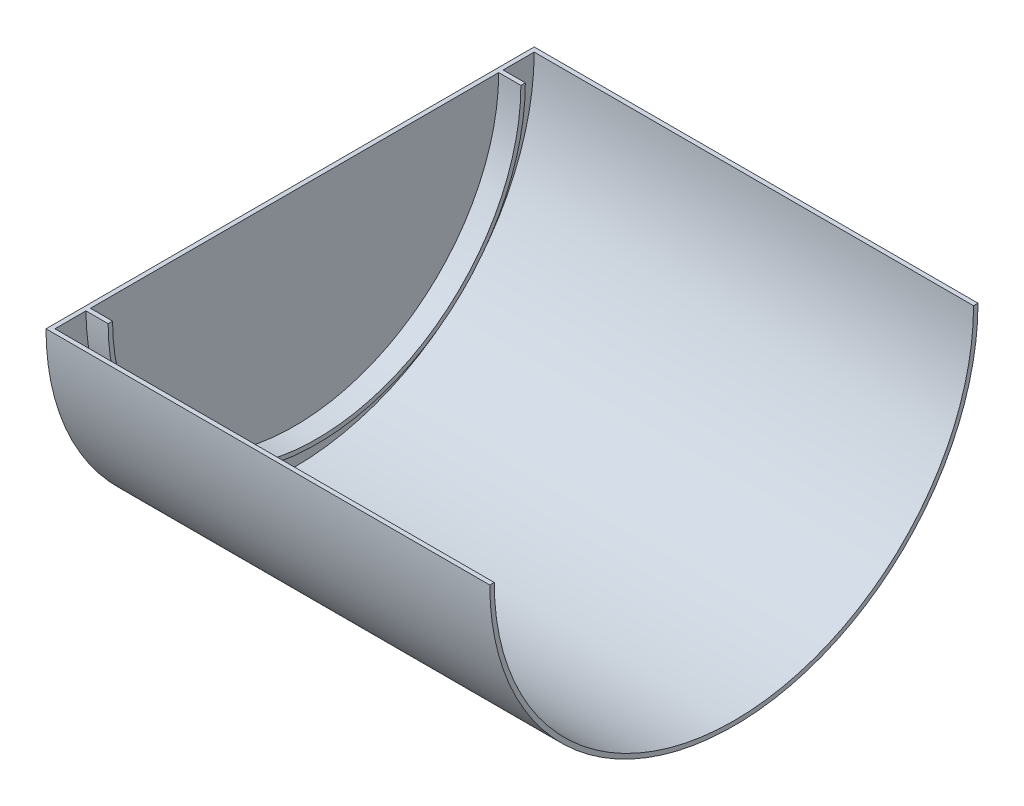
ISO-10303-21;
HEADER;
FILE_DESCRIPTION(('STEP AP214'),'2;1');
FILE_NAME('part.step','',(''),(''),'','','');
FILE_SCHEMA(('AUTOMOTIVE_DESIGN { 1 0 10303 214 1 1 1 1 }'));
ENDSEC;
DATA;
#1=APPLICATION_CONTEXT('core data for automotive mechanical design processes');
#2=APPLICATION_PROTOCOL_DEFINITION('international standard','automotive_design',2000,#1);
#3=PRODUCT_CONTEXT('',#1,'mechanical');
#4=PRODUCT('Part','Part','',(#3));
#5=PRODUCT_RELATED_PRODUCT_CATEGORY('part','',(#4));
#6=PRODUCT_DEFINITION_FORMATION('','',#4);
#7=PRODUCT_DEFINITION_CONTEXT('part definition',#1,'design');
#8=PRODUCT_DEFINITION('design','',#6,#7);
#9=PRODUCT_DEFINITION_SHAPE('','',#8);
#10=(LENGTH_UNIT() NAMED_UNIT(*) SI_UNIT(.MILLI.,.METRE.));
#11=(NAMED_UNIT(*) PLANE_ANGLE_UNIT() SI_UNIT($,.RADIAN.));
#12=(NAMED_UNIT(*) SI_UNIT($,.STERADIAN.) SOLID_ANGLE_UNIT());
#13=UNCERTAINTY_MEASURE_WITH_UNIT(LENGTH_MEASURE(1.E-05),#10,'distance_accuracy_value','');
#14=(GEOMETRIC_REPRESENTATION_CONTEXT(3) GLOBAL_UNCERTAINTY_ASSIGNED_CONTEXT((#13)) GLOBAL_UNIT_ASSIGNED_CONTEXT((#10,
#11,#12)) REPRESENTATION_CONTEXT('',''));
#15=CARTESIAN_POINT('',(0.,0.,0.));
#16=DIRECTION('',(0.,0.,1.));
#17=DIRECTION('',(1.,0.,0.));
#18=AXIS2_PLACEMENT_3D('',#15,#16,#17);
#19=CARTESIAN_POINT('',(1.,0.,0.));
#20=DIRECTION('',(1.,0.,0.));
#21=DIRECTION('',(0.,0.,-1.));
#22=AXIS2_PLACEMENT_3D('',#19,#20,#21);
#23=PLANE('',#22);
#24=DIRECTION('',(0.,0.,1.));
#25=VECTOR('',#24,1.);
#26=CARTESIAN_POINT('',(1.,0.,54.));
#27=LINE('',#26,#25);
#28=CARTESIAN_POINT('',(1.,0.,-46.));
#29=VERTEX_POINT('',#28);
#30=CARTESIAN_POINT('',(1.,0.,46.));
#31=VERTEX_POINT('',#30);
#32=EDGE_CURVE('E62',#29,#31,#27,.T.);
#33=ORIENTED_EDGE('',*,*,#32,.T.);
#34=CARTESIAN_POINT('',(1.,0.,0.));
#35=DIRECTION('',(1.,0.,0.));
#36=DIRECTION('',(0.,0.,-1.));
#37=AXIS2_PLACEMENT_3D('',#34,#35,#36);
#38=CIRCLE('',#37,46.);
#39=EDGE_CURVE('E121',#29,#31,#38,.F.);
#40=ORIENTED_EDGE('',*,*,#39,.F.);
#41=EDGE_LOOP('',(#33,#40));
#42=FACE_BOUND('',#41,.T.);
#43=ADVANCED_FACE('F39',(#42),#23,.T.);
#44=CARTESIAN_POINT('',(100.,0.,0.));
#45=DIRECTION('',(-1.,0.,0.));
#46=DIRECTION('',(0.,0.,1.));
#47=AXIS2_PLACEMENT_3D('',#44,#45,#46);
#48=CYLINDRICAL_SURFACE('',#47,55.);
#49=CARTESIAN_POINT('',(0.,0.,0.));
#50=DIRECTION('',(-1.,0.,0.));
#51=DIRECTION('',(0.,0.,1.));
#52=AXIS2_PLACEMENT_3D('',#49,#50,#51);
#53=CIRCLE('',#52,55.);
#54=CARTESIAN_POINT('',(0.,0.,-55.));
#55=VERTEX_POINT('',#54);
#56=CARTESIAN_POINT('',(0.,0.,55.));
#57=VERTEX_POINT('',#56);
#58=EDGE_CURVE('E165',#55,#57,#53,.T.);
#59=ORIENTED_EDGE('',*,*,#58,.F.);
#60=DIRECTION('',(-1.,0.,0.));
#61=VECTOR('',#60,1.);
#62=CARTESIAN_POINT('',(100.,0.,-55.));
#63=LINE('',#62,#61);
#64=CARTESIAN_POINT('',(100.,0.,-55.));
#65=VERTEX_POINT('',#64);
#66=EDGE_CURVE('E11',#65,#55,#63,.T.);
#67=ORIENTED_EDGE('',*,*,#66,.F.);
#68=CARTESIAN_POINT('',(100.,0.,0.));
#69=DIRECTION('',(-1.,0.,0.));
#70=DIRECTION('',(0.,0.,1.));
#71=AXIS2_PLACEMENT_3D('',#68,#69,#70);
#72=CIRCLE('',#71,55.);
#73=CARTESIAN_POINT('',(100.,0.,55.));
#74=VERTEX_POINT('',#73);
#75=EDGE_CURVE('E169',#65,#74,#72,.T.);
#76=ORIENTED_EDGE('',*,*,#75,.T.);
#77=DIRECTION('',(-1.,0.,0.));
#78=VECTOR('',#77,1.);
#79=CARTESIAN_POINT('',(100.,0.,55.));
#80=LINE('',#79,#78);
#81=EDGE_CURVE('E43',#74,#57,#80,.T.);
#82=ORIENTED_EDGE('',*,*,#81,.T.);
#83=EDGE_LOOP('',(#59,#67,#76,#82));
#84=FACE_BOUND('',#83,.T.);
#85=ADVANCED_FACE('F41',(#84),#48,.T.);
#86=CARTESIAN_POINT('',(100.,0.,55.));
#87=DIRECTION('',(0.,1.,0.));
#88=DIRECTION('',(0.,0.,1.));
#89=AXIS2_PLACEMENT_3D('',#86,#87,#88);
#90=PLANE('',#89);
#91=DIRECTION('',(1.,0.,0.));
#92=VECTOR('',#91,1.);
#93=CARTESIAN_POINT('',(1.,0.,54.));
#94=LINE('',#93,#92);
#95=CARTESIAN_POINT('',(1.,0.,54.));
#96=VERTEX_POINT('',#95);
#97=CARTESIAN_POINT('',(100.,0.,54.));
#98=VERTEX_POINT('',#97);
#99=EDGE_CURVE('E162',#96,#98,#94,.T.);
#100=ORIENTED_EDGE('',*,*,#99,.F.);
#101=CARTESIAN_POINT('',(1.,0.,47.));
#102=VERTEX_POINT('',#101);
#103=EDGE_CURVE('E155',#102,#96,#27,.T.);
#104=ORIENTED_EDGE('',*,*,#103,.F.);
#105=DIRECTION('',(-1.,0.,0.));
#106=VECTOR('',#105,1.);
#107=CARTESIAN_POINT('',(6.,0.,47.));
#108=LINE('',#107,#106);
#109=CARTESIAN_POINT('',(6.,0.,47.));
#110=VERTEX_POINT('',#109);
#111=EDGE_CURVE('E125',#110,#102,#108,.T.);
#112=ORIENTED_EDGE('',*,*,#111,.F.);
#113=DIRECTION('',(0.,0.,-1.));
#114=VECTOR('',#113,1.);
#115=CARTESIAN_POINT('',(6.,0.,47.));
#116=LINE('',#115,#114);
#117=CARTESIAN_POINT('',(6.,0.,46.));
#118=VERTEX_POINT('',#117);
#119=EDGE_CURVE('E110',#110,#118,#116,.T.);
#120=ORIENTED_EDGE('',*,*,#119,.T.);
#121=DIRECTION('',(-1.,0.,0.));
#122=VECTOR('',#121,1.);
#123=CARTESIAN_POINT('',(6.,0.,46.));
#124=LINE('',#123,#122);
#125=EDGE_CURVE('E119',#118,#31,#124,.T.);
#126=ORIENTED_EDGE('',*,*,#125,.T.);
#127=ORIENTED_EDGE('',*,*,#32,.F.);
#128=DIRECTION('',(-1.,0.,0.));
#129=VECTOR('',#128,1.);
#130=CARTESIAN_POINT('',(6.,0.,-46.));
#131=LINE('',#130,#129);
#132=CARTESIAN_POINT('',(6.,0.,-46.));
#133=VERTEX_POINT('',#132);
#134=EDGE_CURVE('E138',#133,#29,#131,.T.);
#135=ORIENTED_EDGE('',*,*,#134,.F.);
#136=DIRECTION('',(0.,0.,-1.));
#137=VECTOR('',#136,1.);
#138=CARTESIAN_POINT('',(6.,0.,-46.));
#139=LINE('',#138,#137);
#140=CARTESIAN_POINT('',(6.,0.,-47.));
#141=VERTEX_POINT('',#140);
#142=EDGE_CURVE('E113',#133,#141,#139,.T.);
#143=ORIENTED_EDGE('',*,*,#142,.T.);
#144=DIRECTION('',(-1.,0.,0.));
#145=VECTOR('',#144,1.);
#146=CARTESIAN_POINT('',(6.,0.,-47.));
#147=LINE('',#146,#145);
#148=CARTESIAN_POINT('',(1.,0.,-47.));
#149=VERTEX_POINT('',#148);
#150=EDGE_CURVE('E145',#141,#149,#147,.T.);
#151=ORIENTED_EDGE('',*,*,#150,.T.);
#152=CARTESIAN_POINT('',(1.,0.,-54.));
#153=VERTEX_POINT('',#152);
#154=EDGE_CURVE('E156',#153,#149,#27,.T.);
#155=ORIENTED_EDGE('',*,*,#154,.F.);
#156=DIRECTION('',(1.,0.,0.));
#157=VECTOR('',#156,1.);
#158=CARTESIAN_POINT('',(1.,0.,-54.));
#159=LINE('',#158,#157);
#160=CARTESIAN_POINT('',(100.,0.,-54.));
#161=VERTEX_POINT('',#160);
#162=EDGE_CURVE('E159',#153,#161,#159,.T.);
#163=ORIENTED_EDGE('',*,*,#162,.T.);
#164=DIRECTION('',(0.,0.,-1.));
#165=VECTOR('',#164,1.);
#166=CARTESIAN_POINT('',(100.,0.,55.));
#167=LINE('',#166,#165);
#168=EDGE_CURVE('E173',#161,#65,#167,.T.);
#169=ORIENTED_EDGE('',*,*,#168,.T.);
#170=ORIENTED_EDGE('',*,*,#66,.T.);
#171=DIRECTION('',(0.,0.,-1.));
#172=VECTOR('',#171,1.);
#173=CARTESIAN_POINT('',(0.,0.,55.));
#174=LINE('',#173,#172);
#175=EDGE_CURVE('E174',#57,#55,#174,.T.);
#176=ORIENTED_EDGE('',*,*,#175,.F.);
#177=ORIENTED_EDGE('',*,*,#81,.F.);
#178=EDGE_CURVE('E175',#74,#98,#167,.T.);
#179=ORIENTED_EDGE('',*,*,#178,.T.);
#180=EDGE_LOOP('',(#100,#104,#112,#120,#126,#127,#135,#143,#151,#155,#163,#169,#170,#176,#177,#179));
#181=FACE_BOUND('',#180,.T.);
#182=ADVANCED_FACE('F128',(#181),#90,.T.);
#183=CARTESIAN_POINT('',(100.,0.,0.));
#184=DIRECTION('',(-1.,0.,0.));
#185=DIRECTION('',(0.,0.,1.));
#186=AXIS2_PLACEMENT_3D('',#183,#184,#185);
#187=PLANE('',#186);
#188=ORIENTED_EDGE('',*,*,#168,.F.);
#189=CARTESIAN_POINT('',(100.,0.,0.));
#190=DIRECTION('',(1.,0.,0.));
#191=DIRECTION('',(0.,0.,-1.));
#192=AXIS2_PLACEMENT_3D('',#189,#190,#191);
#193=CIRCLE('',#192,54.);
#194=EDGE_CURVE('E124',#98,#161,#193,.T.);
#195=ORIENTED_EDGE('',*,*,#194,.F.);
#196=ORIENTED_EDGE('',*,*,#178,.F.);
#197=ORIENTED_EDGE('',*,*,#75,.F.);
#198=EDGE_LOOP('',(#188,#195,#196,#197));
#199=FACE_BOUND('',#198,.T.);
#200=ADVANCED_FACE('F197',(#199),#187,.F.);
#201=CARTESIAN_POINT('',(0.,0.,0.));
#202=DIRECTION('',(-1.,0.,0.));
#203=DIRECTION('',(0.,0.,1.));
#204=AXIS2_PLACEMENT_3D('',#201,#202,#203);
#205=PLANE('',#204);
#206=ORIENTED_EDGE('',*,*,#58,.T.);
#207=ORIENTED_EDGE('',*,*,#175,.T.);
#208=EDGE_LOOP('',(#206,#207));
#209=FACE_BOUND('',#208,.T.);
#210=ADVANCED_FACE('F186',(#209),#205,.T.);
#211=CARTESIAN_POINT('',(1.,0.,0.));
#212=DIRECTION('',(1.,0.,0.));
#213=DIRECTION('',(0.,0.,-1.));
#214=AXIS2_PLACEMENT_3D('',#211,#212,#213);
#215=CYLINDRICAL_SURFACE('',#214,54.);
#216=ORIENTED_EDGE('',*,*,#194,.T.);
#217=ORIENTED_EDGE('',*,*,#162,.F.);
#218=CARTESIAN_POINT('',(1.,0.,0.));
#219=DIRECTION('',(1.,0.,0.));
#220=DIRECTION('',(0.,0.,-1.));
#221=AXIS2_PLACEMENT_3D('',#218,#219,#220);
#222=CIRCLE('',#221,54.);
#223=EDGE_CURVE('E151',#96,#153,#222,.T.);
#224=ORIENTED_EDGE('',*,*,#223,.F.);
#225=ORIENTED_EDGE('',*,*,#99,.T.);
#226=EDGE_LOOP('',(#216,#217,#224,#225));
#227=FACE_BOUND('',#226,.T.);
#228=ADVANCED_FACE('F200',(#227),#215,.F.);
#229=CARTESIAN_POINT('',(1.,0.,0.));
#230=DIRECTION('',(-1.,0.,0.));
#231=DIRECTION('',(0.,0.,1.));
#232=AXIS2_PLACEMENT_3D('',#229,#230,#231);
#233=CIRCLE('',#232,47.);
#234=EDGE_CURVE('E55',#149,#102,#233,.T.);
#235=ORIENTED_EDGE('',*,*,#234,.T.);
#236=ORIENTED_EDGE('',*,*,#103,.T.);
#237=ORIENTED_EDGE('',*,*,#223,.T.);
#238=ORIENTED_EDGE('',*,*,#154,.T.);
#239=EDGE_LOOP('',(#235,#236,#237,#238));
#240=FACE_BOUND('',#239,.T.);
#241=ADVANCED_FACE('F202',(#240),#23,.T.);
#242=CARTESIAN_POINT('',(6.,0.,0.));
#243=DIRECTION('',(-1.,0.,0.));
#244=DIRECTION('',(0.,0.,1.));
#245=AXIS2_PLACEMENT_3D('',#242,#243,#244);
#246=CYLINDRICAL_SURFACE('',#245,46.);
#247=ORIENTED_EDGE('',*,*,#39,.T.);
#248=ORIENTED_EDGE('',*,*,#125,.F.);
#249=CARTESIAN_POINT('',(6.,0.,0.));
#250=DIRECTION('',(1.,0.,0.));
#251=DIRECTION('',(0.,0.,-1.));
#252=AXIS2_PLACEMENT_3D('',#249,#250,#251);
#253=CIRCLE('',#252,46.);
#254=EDGE_CURVE('E105',#133,#118,#253,.F.);
#255=ORIENTED_EDGE('',*,*,#254,.F.);
#256=ORIENTED_EDGE('',*,*,#134,.T.);
#257=EDGE_LOOP('',(#247,#248,#255,#256));
#258=FACE_BOUND('',#257,.T.);
#259=ADVANCED_FACE('F120',(#258),#246,.F.);
#260=CARTESIAN_POINT('',(6.,0.,0.));
#261=DIRECTION('',(-1.,0.,0.));
#262=DIRECTION('',(0.,0.,1.));
#263=AXIS2_PLACEMENT_3D('',#260,#261,#262);
#264=CYLINDRICAL_SURFACE('',#263,47.);
#265=ORIENTED_EDGE('',*,*,#234,.F.);
#266=ORIENTED_EDGE('',*,*,#150,.F.);
#267=CARTESIAN_POINT('',(6.,0.,0.));
#268=DIRECTION('',(-1.,0.,0.));
#269=DIRECTION('',(0.,0.,1.));
#270=AXIS2_PLACEMENT_3D('',#267,#268,#269);
#271=CIRCLE('',#270,47.);
#272=EDGE_CURVE('E131',#141,#110,#271,.T.);
#273=ORIENTED_EDGE('',*,*,#272,.T.);
#274=ORIENTED_EDGE('',*,*,#111,.T.);
#275=EDGE_LOOP('',(#265,#266,#273,#274));
#276=FACE_BOUND('',#275,.T.);
#277=ADVANCED_FACE('F204',(#276),#264,.T.);
#278=CARTESIAN_POINT('',(6.,0.,0.));
#279=DIRECTION('',(1.,0.,0.));
#280=DIRECTION('',(0.,0.,-1.));
#281=AXIS2_PLACEMENT_3D('',#278,#279,#280);
#282=PLANE('',#281);
#283=ORIENTED_EDGE('',*,*,#254,.T.);
#284=ORIENTED_EDGE('',*,*,#119,.F.);
#285=ORIENTED_EDGE('',*,*,#272,.F.);
#286=ORIENTED_EDGE('',*,*,#142,.F.);
#287=EDGE_LOOP('',(#283,#284,#285,#286));
#288=FACE_BOUND('',#287,.T.);
#289=ADVANCED_FACE('F107',(#288),#282,.T.);
#290=CLOSED_SHELL('',(#43,#85,#182,#200,#210,#228,#241,#259,#277,#289));
#291=MANIFOLD_SOLID_BREP('B2',#290);
#292=ADVANCED_BREP_SHAPE_REPRESENTATION('',(#18,#291),#14);
#293=SHAPE_DEFINITION_REPRESENTATION(#9,#292);
ENDSEC;
END-ISO-10303-21;
